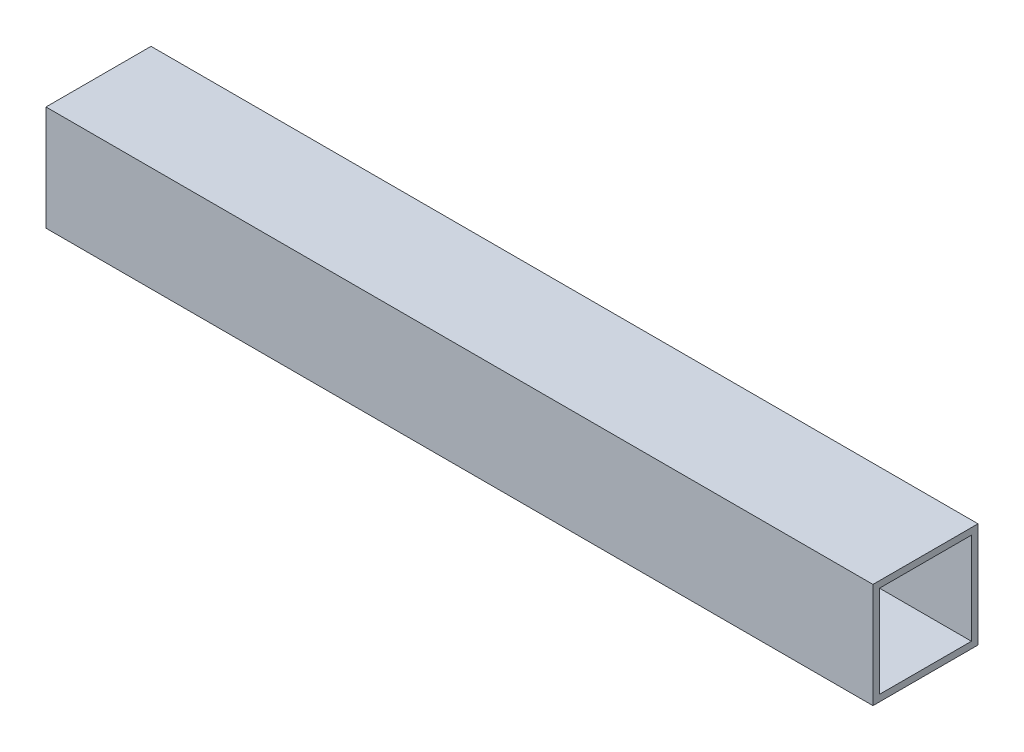
ISO-10303-21;
HEADER;
FILE_DESCRIPTION(('STEP AP214'),'2;1');
FILE_NAME('part.step','',(''),(''),'','','');
FILE_SCHEMA(('AUTOMOTIVE_DESIGN { 1 0 10303 214 1 1 1 1 }'));
ENDSEC;
DATA;
#1=APPLICATION_CONTEXT('core data for automotive mechanical design processes');
#2=APPLICATION_PROTOCOL_DEFINITION('international standard','automotive_design',2000,#1);
#3=PRODUCT_CONTEXT('',#1,'mechanical');
#4=PRODUCT('Part','Part','',(#3));
#5=PRODUCT_RELATED_PRODUCT_CATEGORY('part','',(#4));
#6=PRODUCT_DEFINITION_FORMATION('','',#4);
#7=PRODUCT_DEFINITION_CONTEXT('part definition',#1,'design');
#8=PRODUCT_DEFINITION('design','',#6,#7);
#9=PRODUCT_DEFINITION_SHAPE('','',#8);
#10=(LENGTH_UNIT() NAMED_UNIT(*) SI_UNIT(.MILLI.,.METRE.));
#11=(NAMED_UNIT(*) PLANE_ANGLE_UNIT() SI_UNIT($,.RADIAN.));
#12=(NAMED_UNIT(*) SI_UNIT($,.STERADIAN.) SOLID_ANGLE_UNIT());
#13=UNCERTAINTY_MEASURE_WITH_UNIT(LENGTH_MEASURE(1.E-05),#10,'distance_accuracy_value','');
#14=(GEOMETRIC_REPRESENTATION_CONTEXT(3) GLOBAL_UNCERTAINTY_ASSIGNED_CONTEXT((#13)) GLOBAL_UNIT_ASSIGNED_CONTEXT((#10,
#11,#12)) REPRESENTATION_CONTEXT('',''));
#15=CARTESIAN_POINT('',(0.,0.,0.));
#16=DIRECTION('',(0.,0.,1.));
#17=DIRECTION('',(1.,0.,0.));
#18=AXIS2_PLACEMENT_3D('',#15,#16,#17);
#19=CARTESIAN_POINT('',(200.,0.,0.));
#20=DIRECTION('',(1.,0.,0.));
#21=DIRECTION('',(0.,0.,-1.));
#22=AXIS2_PLACEMENT_3D('',#19,#20,#21);
#23=PLANE('',#22);
#24=DIRECTION('',(0.,-1.,0.));
#25=VECTOR('',#24,1.);
#26=CARTESIAN_POINT('',(200.,-12.7,12.7));
#27=LINE('',#26,#25);
#28=CARTESIAN_POINT('',(200.,12.7,12.7));
#29=VERTEX_POINT('',#28);
#30=CARTESIAN_POINT('',(200.,-12.7,12.7));
#31=VERTEX_POINT('',#30);
#32=EDGE_CURVE('E134',#29,#31,#27,.T.);
#33=ORIENTED_EDGE('',*,*,#32,.T.);
#34=DIRECTION('',(0.,0.,-1.));
#35=VECTOR('',#34,1.);
#36=CARTESIAN_POINT('',(200.,-12.7,-12.7));
#37=LINE('',#36,#35);
#38=CARTESIAN_POINT('',(200.,-12.7,-12.7));
#39=VERTEX_POINT('',#38);
#40=EDGE_CURVE('E137',#31,#39,#37,.T.);
#41=ORIENTED_EDGE('',*,*,#40,.T.);
#42=DIRECTION('',(0.,1.,0.));
#43=VECTOR('',#42,1.);
#44=CARTESIAN_POINT('',(200.,-12.7,-12.7));
#45=LINE('',#44,#43);
#46=CARTESIAN_POINT('',(200.,12.7,-12.7));
#47=VERTEX_POINT('',#46);
#48=EDGE_CURVE('E140',#39,#47,#45,.T.);
#49=ORIENTED_EDGE('',*,*,#48,.T.);
#50=DIRECTION('',(0.,0.,1.));
#51=VECTOR('',#50,1.);
#52=CARTESIAN_POINT('',(200.,12.7,-12.7));
#53=LINE('',#52,#51);
#54=EDGE_CURVE('E142',#47,#29,#53,.T.);
#55=ORIENTED_EDGE('',*,*,#54,.T.);
#56=EDGE_LOOP('',(#33,#41,#49,#55));
#57=FACE_BOUND('',#56,.T.);
#58=DIRECTION('',(0.,0.,-1.));
#59=VECTOR('',#58,1.);
#60=CARTESIAN_POINT('',(200.,-11.1125,-11.1125));
#61=LINE('',#60,#59);
#62=CARTESIAN_POINT('',(200.,-11.1125,11.1125));
#63=VERTEX_POINT('',#62);
#64=CARTESIAN_POINT('',(200.,-11.1125,-11.1125));
#65=VERTEX_POINT('',#64);
#66=EDGE_CURVE('E106',#63,#65,#61,.T.);
#67=ORIENTED_EDGE('',*,*,#66,.F.);
#68=DIRECTION('',(0.,-1.,0.));
#69=VECTOR('',#68,1.);
#70=CARTESIAN_POINT('',(200.,-11.1125,11.1125));
#71=LINE('',#70,#69);
#72=CARTESIAN_POINT('',(200.,11.1125,11.1125));
#73=VERTEX_POINT('',#72);
#74=EDGE_CURVE('E98',#73,#63,#71,.T.);
#75=ORIENTED_EDGE('',*,*,#74,.F.);
#76=DIRECTION('',(0.,0.,1.));
#77=VECTOR('',#76,1.);
#78=CARTESIAN_POINT('',(200.,11.1125,-11.1125));
#79=LINE('',#78,#77);
#80=CARTESIAN_POINT('',(200.,11.1125,-11.1125));
#81=VERTEX_POINT('',#80);
#82=EDGE_CURVE('E120',#81,#73,#79,.T.);
#83=ORIENTED_EDGE('',*,*,#82,.F.);
#84=DIRECTION('',(0.,1.,0.));
#85=VECTOR('',#84,1.);
#86=CARTESIAN_POINT('',(200.,-11.1125,-11.1125));
#87=LINE('',#86,#85);
#88=EDGE_CURVE('E118',#65,#81,#87,.T.);
#89=ORIENTED_EDGE('',*,*,#88,.F.);
#90=EDGE_LOOP('',(#67,#75,#83,#89));
#91=FACE_BOUND('',#90,.T.);
#92=ADVANCED_FACE('F33',(#57,#91),#23,.T.);
#93=CARTESIAN_POINT('',(0.,0.,0.));
#94=DIRECTION('',(1.,0.,0.));
#95=DIRECTION('',(0.,0.,-1.));
#96=AXIS2_PLACEMENT_3D('',#93,#94,#95);
#97=PLANE('',#96);
#98=DIRECTION('',(0.,-1.,0.));
#99=VECTOR('',#98,1.);
#100=CARTESIAN_POINT('',(0.,-12.7,12.7));
#101=LINE('',#100,#99);
#102=CARTESIAN_POINT('',(0.,12.7,12.7));
#103=VERTEX_POINT('',#102);
#104=CARTESIAN_POINT('',(0.,-12.7,12.7));
#105=VERTEX_POINT('',#104);
#106=EDGE_CURVE('E114',#103,#105,#101,.T.);
#107=ORIENTED_EDGE('',*,*,#106,.F.);
#108=DIRECTION('',(0.,0.,1.));
#109=VECTOR('',#108,1.);
#110=CARTESIAN_POINT('',(0.,12.7,-12.7));
#111=LINE('',#110,#109);
#112=CARTESIAN_POINT('',(0.,12.7,-12.7));
#113=VERTEX_POINT('',#112);
#114=EDGE_CURVE('E138',#113,#103,#111,.T.);
#115=ORIENTED_EDGE('',*,*,#114,.F.);
#116=DIRECTION('',(0.,1.,0.));
#117=VECTOR('',#116,1.);
#118=CARTESIAN_POINT('',(0.,-12.7,-12.7));
#119=LINE('',#118,#117);
#120=CARTESIAN_POINT('',(0.,-12.7,-12.7));
#121=VERTEX_POINT('',#120);
#122=EDGE_CURVE('E149',#121,#113,#119,.T.);
#123=ORIENTED_EDGE('',*,*,#122,.F.);
#124=DIRECTION('',(0.,0.,-1.));
#125=VECTOR('',#124,1.);
#126=CARTESIAN_POINT('',(0.,-12.7,-12.7));
#127=LINE('',#126,#125);
#128=EDGE_CURVE('E147',#105,#121,#127,.T.);
#129=ORIENTED_EDGE('',*,*,#128,.F.);
#130=EDGE_LOOP('',(#107,#115,#123,#129));
#131=FACE_BOUND('',#130,.T.);
#132=DIRECTION('',(0.,-1.,0.));
#133=VECTOR('',#132,1.);
#134=CARTESIAN_POINT('',(0.,-11.1125,11.1125));
#135=LINE('',#134,#133);
#136=CARTESIAN_POINT('',(0.,11.1125,11.1125));
#137=VERTEX_POINT('',#136);
#138=CARTESIAN_POINT('',(0.,-11.1125,11.1125));
#139=VERTEX_POINT('',#138);
#140=EDGE_CURVE('E56',#137,#139,#135,.T.);
#141=ORIENTED_EDGE('',*,*,#140,.T.);
#142=DIRECTION('',(0.,0.,-1.));
#143=VECTOR('',#142,1.);
#144=CARTESIAN_POINT('',(0.,-11.1125,-11.1125));
#145=LINE('',#144,#143);
#146=CARTESIAN_POINT('',(0.,-11.1125,-11.1125));
#147=VERTEX_POINT('',#146);
#148=EDGE_CURVE('E113',#139,#147,#145,.T.);
#149=ORIENTED_EDGE('',*,*,#148,.T.);
#150=DIRECTION('',(0.,1.,0.));
#151=VECTOR('',#150,1.);
#152=CARTESIAN_POINT('',(0.,-11.1125,-11.1125));
#153=LINE('',#152,#151);
#154=CARTESIAN_POINT('',(0.,11.1125,-11.1125));
#155=VERTEX_POINT('',#154);
#156=EDGE_CURVE('E126',#147,#155,#153,.T.);
#157=ORIENTED_EDGE('',*,*,#156,.T.);
#158=DIRECTION('',(0.,0.,1.));
#159=VECTOR('',#158,1.);
#160=CARTESIAN_POINT('',(0.,11.1125,-11.1125));
#161=LINE('',#160,#159);
#162=EDGE_CURVE('E107',#155,#137,#161,.T.);
#163=ORIENTED_EDGE('',*,*,#162,.T.);
#164=EDGE_LOOP('',(#141,#149,#157,#163));
#165=FACE_BOUND('',#164,.T.);
#166=ADVANCED_FACE('F167',(#131,#165),#97,.F.);
#167=CARTESIAN_POINT('',(200.,-12.7,12.7));
#168=DIRECTION('',(0.,0.,-1.));
#169=DIRECTION('',(-1.,0.,0.));
#170=AXIS2_PLACEMENT_3D('',#167,#168,#169);
#171=PLANE('',#170);
#172=ORIENTED_EDGE('',*,*,#106,.T.);
#173=DIRECTION('',(-1.,0.,0.));
#174=VECTOR('',#173,1.);
#175=CARTESIAN_POINT('',(200.,-12.7,12.7));
#176=LINE('',#175,#174);
#177=EDGE_CURVE('E11',#31,#105,#176,.T.);
#178=ORIENTED_EDGE('',*,*,#177,.F.);
#179=ORIENTED_EDGE('',*,*,#32,.F.);
#180=DIRECTION('',(-1.,0.,0.));
#181=VECTOR('',#180,1.);
#182=CARTESIAN_POINT('',(200.,12.7,12.7));
#183=LINE('',#182,#181);
#184=EDGE_CURVE('E144',#29,#103,#183,.T.);
#185=ORIENTED_EDGE('',*,*,#184,.T.);
#186=EDGE_LOOP('',(#172,#178,#179,#185));
#187=FACE_BOUND('',#186,.T.);
#188=ADVANCED_FACE('F35',(#187),#171,.F.);
#189=CARTESIAN_POINT('',(200.,-12.7,-12.7));
#190=DIRECTION('',(0.,1.,0.));
#191=DIRECTION('',(0.,0.,1.));
#192=AXIS2_PLACEMENT_3D('',#189,#190,#191);
#193=PLANE('',#192);
#194=ORIENTED_EDGE('',*,*,#128,.T.);
#195=DIRECTION('',(-1.,0.,0.));
#196=VECTOR('',#195,1.);
#197=CARTESIAN_POINT('',(200.,-12.7,-12.7));
#198=LINE('',#197,#196);
#199=EDGE_CURVE('E41',#39,#121,#198,.T.);
#200=ORIENTED_EDGE('',*,*,#199,.F.);
#201=ORIENTED_EDGE('',*,*,#40,.F.);
#202=ORIENTED_EDGE('',*,*,#177,.T.);
#203=EDGE_LOOP('',(#194,#200,#201,#202));
#204=FACE_BOUND('',#203,.T.);
#205=ADVANCED_FACE('F177',(#204),#193,.F.);
#206=CARTESIAN_POINT('',(200.,-12.7,-12.7));
#207=DIRECTION('',(0.,0.,1.));
#208=DIRECTION('',(1.,0.,0.));
#209=AXIS2_PLACEMENT_3D('',#206,#207,#208);
#210=PLANE('',#209);
#211=ORIENTED_EDGE('',*,*,#122,.T.);
#212=DIRECTION('',(-1.,0.,0.));
#213=VECTOR('',#212,1.);
#214=CARTESIAN_POINT('',(200.,12.7,-12.7));
#215=LINE('',#214,#213);
#216=EDGE_CURVE('E154',#47,#113,#215,.T.);
#217=ORIENTED_EDGE('',*,*,#216,.F.);
#218=ORIENTED_EDGE('',*,*,#48,.F.);
#219=ORIENTED_EDGE('',*,*,#199,.T.);
#220=EDGE_LOOP('',(#211,#217,#218,#219));
#221=FACE_BOUND('',#220,.T.);
#222=ADVANCED_FACE('F161',(#221),#210,.F.);
#223=CARTESIAN_POINT('',(200.,12.7,-12.7));
#224=DIRECTION('',(0.,-1.,0.));
#225=DIRECTION('',(0.,0.,-1.));
#226=AXIS2_PLACEMENT_3D('',#223,#224,#225);
#227=PLANE('',#226);
#228=ORIENTED_EDGE('',*,*,#114,.T.);
#229=ORIENTED_EDGE('',*,*,#184,.F.);
#230=ORIENTED_EDGE('',*,*,#54,.F.);
#231=ORIENTED_EDGE('',*,*,#216,.T.);
#232=EDGE_LOOP('',(#228,#229,#230,#231));
#233=FACE_BOUND('',#232,.T.);
#234=ADVANCED_FACE('F171',(#233),#227,.F.);
#235=CARTESIAN_POINT('',(200.,-11.1125,11.1125));
#236=DIRECTION('',(0.,0.,-1.));
#237=DIRECTION('',(-1.,0.,0.));
#238=AXIS2_PLACEMENT_3D('',#235,#236,#237);
#239=PLANE('',#238);
#240=ORIENTED_EDGE('',*,*,#140,.F.);
#241=DIRECTION('',(-1.,0.,0.));
#242=VECTOR('',#241,1.);
#243=CARTESIAN_POINT('',(200.,11.1125,11.1125));
#244=LINE('',#243,#242);
#245=EDGE_CURVE('E102',#73,#137,#244,.T.);
#246=ORIENTED_EDGE('',*,*,#245,.F.);
#247=ORIENTED_EDGE('',*,*,#74,.T.);
#248=DIRECTION('',(-1.,0.,0.));
#249=VECTOR('',#248,1.);
#250=CARTESIAN_POINT('',(200.,-11.1125,11.1125));
#251=LINE('',#250,#249);
#252=EDGE_CURVE('E101',#63,#139,#251,.T.);
#253=ORIENTED_EDGE('',*,*,#252,.T.);
#254=EDGE_LOOP('',(#240,#246,#247,#253));
#255=FACE_BOUND('',#254,.T.);
#256=ADVANCED_FACE('F100',(#255),#239,.T.);
#257=CARTESIAN_POINT('',(200.,-11.1125,-11.1125));
#258=DIRECTION('',(0.,1.,0.));
#259=DIRECTION('',(0.,0.,1.));
#260=AXIS2_PLACEMENT_3D('',#257,#258,#259);
#261=PLANE('',#260);
#262=ORIENTED_EDGE('',*,*,#148,.F.);
#263=ORIENTED_EDGE('',*,*,#252,.F.);
#264=ORIENTED_EDGE('',*,*,#66,.T.);
#265=DIRECTION('',(-1.,0.,0.));
#266=VECTOR('',#265,1.);
#267=CARTESIAN_POINT('',(200.,-11.1125,-11.1125));
#268=LINE('',#267,#266);
#269=EDGE_CURVE('E115',#65,#147,#268,.T.);
#270=ORIENTED_EDGE('',*,*,#269,.T.);
#271=EDGE_LOOP('',(#262,#263,#264,#270));
#272=FACE_BOUND('',#271,.T.);
#273=ADVANCED_FACE('F110',(#272),#261,.T.);
#274=CARTESIAN_POINT('',(200.,-11.1125,-11.1125));
#275=DIRECTION('',(0.,0.,1.));
#276=DIRECTION('',(1.,0.,0.));
#277=AXIS2_PLACEMENT_3D('',#274,#275,#276);
#278=PLANE('',#277);
#279=ORIENTED_EDGE('',*,*,#156,.F.);
#280=ORIENTED_EDGE('',*,*,#269,.F.);
#281=ORIENTED_EDGE('',*,*,#88,.T.);
#282=DIRECTION('',(-1.,0.,0.));
#283=VECTOR('',#282,1.);
#284=CARTESIAN_POINT('',(200.,11.1125,-11.1125));
#285=LINE('',#284,#283);
#286=EDGE_CURVE('E48',#81,#155,#285,.T.);
#287=ORIENTED_EDGE('',*,*,#286,.T.);
#288=EDGE_LOOP('',(#279,#280,#281,#287));
#289=FACE_BOUND('',#288,.T.);
#290=ADVANCED_FACE('F200',(#289),#278,.T.);
#291=CARTESIAN_POINT('',(200.,11.1125,-11.1125));
#292=DIRECTION('',(0.,-1.,0.));
#293=DIRECTION('',(0.,0.,-1.));
#294=AXIS2_PLACEMENT_3D('',#291,#292,#293);
#295=PLANE('',#294);
#296=ORIENTED_EDGE('',*,*,#162,.F.);
#297=ORIENTED_EDGE('',*,*,#286,.F.);
#298=ORIENTED_EDGE('',*,*,#82,.T.);
#299=ORIENTED_EDGE('',*,*,#245,.T.);
#300=EDGE_LOOP('',(#296,#297,#298,#299));
#301=FACE_BOUND('',#300,.T.);
#302=ADVANCED_FACE('F204',(#301),#295,.T.);
#303=CLOSED_SHELL('',(#92,#166,#188,#205,#222,#234,#256,#273,#290,#302));
#304=MANIFOLD_SOLID_BREP('B2',#303);
#305=ADVANCED_BREP_SHAPE_REPRESENTATION('',(#18,#304),#14);
#306=SHAPE_DEFINITION_REPRESENTATION(#9,#305);
ENDSEC;
END-ISO-10303-21;
